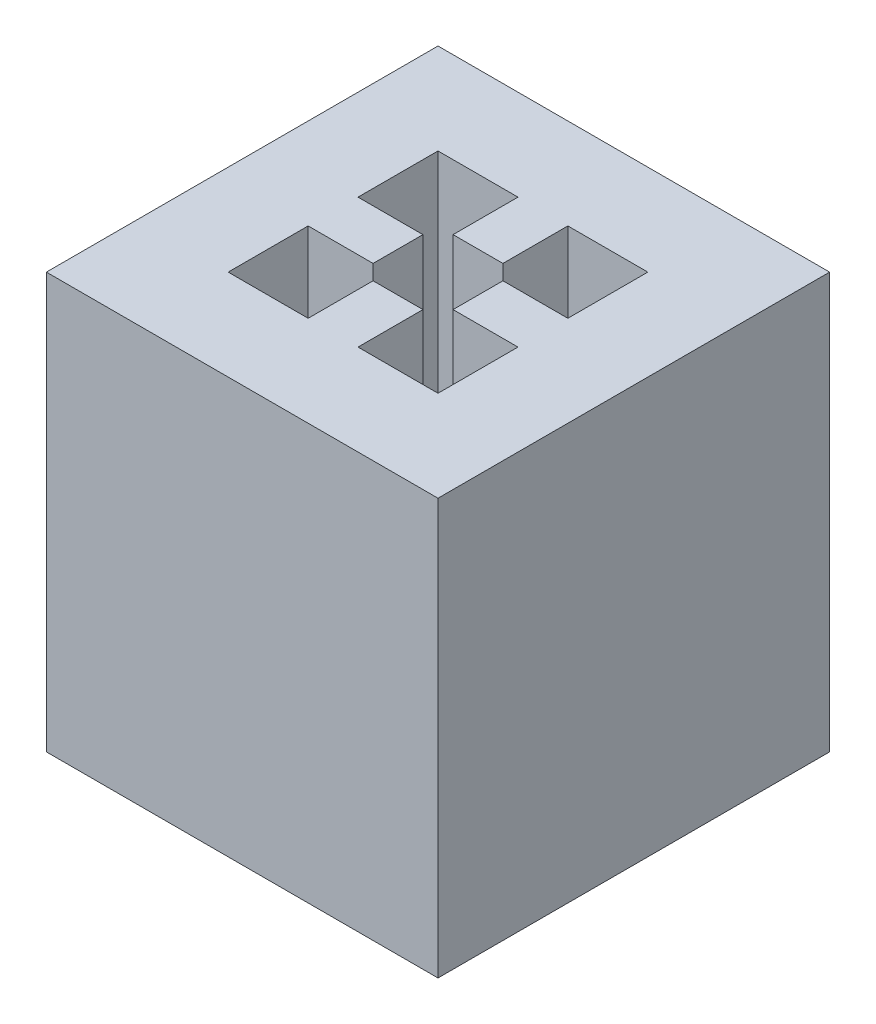
ISO-10303-21;
HEADER;
FILE_DESCRIPTION(('STEP AP214'),'2;1');
FILE_NAME('part.step','',(''),(''),'','','');
FILE_SCHEMA(('AUTOMOTIVE_DESIGN { 1 0 10303 214 1 1 1 1 }'));
ENDSEC;
DATA;
#1=APPLICATION_CONTEXT('core data for automotive mechanical design processes');
#2=APPLICATION_PROTOCOL_DEFINITION('international standard','automotive_design',2000,#1);
#3=PRODUCT_CONTEXT('',#1,'mechanical');
#4=PRODUCT('Part','Part','',(#3));
#5=PRODUCT_RELATED_PRODUCT_CATEGORY('part','',(#4));
#6=PRODUCT_DEFINITION_FORMATION('','',#4);
#7=PRODUCT_DEFINITION_CONTEXT('part definition',#1,'design');
#8=PRODUCT_DEFINITION('design','',#6,#7);
#9=PRODUCT_DEFINITION_SHAPE('','',#8);
#10=(LENGTH_UNIT() NAMED_UNIT(*) SI_UNIT(.MILLI.,.METRE.));
#11=(NAMED_UNIT(*) PLANE_ANGLE_UNIT() SI_UNIT($,.RADIAN.));
#12=(NAMED_UNIT(*) SI_UNIT($,.STERADIAN.) SOLID_ANGLE_UNIT());
#13=UNCERTAINTY_MEASURE_WITH_UNIT(LENGTH_MEASURE(1.E-05),#10,'distance_accuracy_value','');
#14=(GEOMETRIC_REPRESENTATION_CONTEXT(3) GLOBAL_UNCERTAINTY_ASSIGNED_CONTEXT((#13)) GLOBAL_UNIT_ASSIGNED_CONTEXT((#10,
#11,#12)) REPRESENTATION_CONTEXT('',''));
#15=CARTESIAN_POINT('',(0.,0.,0.));
#16=DIRECTION('',(0.,0.,1.));
#17=DIRECTION('',(1.,0.,0.));
#18=AXIS2_PLACEMENT_3D('',#15,#16,#17);
#19=CARTESIAN_POINT('',(0.,40.,0.));
#20=DIRECTION('',(0.,1.,0.));
#21=DIRECTION('',(0.,0.,1.));
#22=AXIS2_PLACEMENT_3D('',#19,#20,#21);
#23=PLANE('',#22);
#24=DIRECTION('',(0.,0.,-1.));
#25=VECTOR('',#24,1.);
#26=CARTESIAN_POINT('',(18.85,40.,-18.85));
#27=LINE('',#26,#25);
#28=CARTESIAN_POINT('',(18.85,40.,18.85));
#29=VERTEX_POINT('',#28);
#30=CARTESIAN_POINT('',(18.85,40.,-18.85));
#31=VERTEX_POINT('',#30);
#32=EDGE_CURVE('E343',#29,#31,#27,.T.);
#33=ORIENTED_EDGE('',*,*,#32,.T.);
#34=DIRECTION('',(-1.,0.,0.));
#35=VECTOR('',#34,1.);
#36=CARTESIAN_POINT('',(-18.85,40.,-18.85));
#37=LINE('',#36,#35);
#38=CARTESIAN_POINT('',(-18.85,40.,-18.85));
#39=VERTEX_POINT('',#38);
#40=EDGE_CURVE('E346',#31,#39,#37,.T.);
#41=ORIENTED_EDGE('',*,*,#40,.T.);
#42=DIRECTION('',(0.,0.,1.));
#43=VECTOR('',#42,1.);
#44=CARTESIAN_POINT('',(-18.85,40.,-18.85));
#45=LINE('',#44,#43);
#46=CARTESIAN_POINT('',(-18.85,40.,18.85));
#47=VERTEX_POINT('',#46);
#48=EDGE_CURVE('E349',#39,#47,#45,.T.);
#49=ORIENTED_EDGE('',*,*,#48,.T.);
#50=DIRECTION('',(1.,0.,0.));
#51=VECTOR('',#50,1.);
#52=CARTESIAN_POINT('',(-18.85,40.,18.85));
#53=LINE('',#52,#51);
#54=EDGE_CURVE('E351',#47,#29,#53,.T.);
#55=ORIENTED_EDGE('',*,*,#54,.T.);
#56=EDGE_LOOP('',(#33,#41,#49,#55));
#57=FACE_BOUND('',#56,.T.);
#58=DIRECTION('',(1.,0.,0.));
#59=VECTOR('',#58,1.);
#60=CARTESIAN_POINT('',(-10.0999999999999,40.,-2.40000000000002));
#61=LINE('',#60,#59);
#62=CARTESIAN_POINT('',(-10.0999999999999,40.,-2.40000000000002));
#63=VERTEX_POINT('',#62);
#64=CARTESIAN_POINT('',(-3.85000000000003,40.,-2.40000000000002));
#65=VERTEX_POINT('',#64);
#66=EDGE_CURVE('E202',#63,#65,#61,.T.);
#67=ORIENTED_EDGE('',*,*,#66,.F.);
#68=DIRECTION('',(0.,0.,1.));
#69=VECTOR('',#68,1.);
#70=CARTESIAN_POINT('',(-10.0999999999999,40.,-2.40000000000002));
#71=LINE('',#70,#69);
#72=CARTESIAN_POINT('',(-10.0999999999999,40.,-10.0999999999999));
#73=VERTEX_POINT('',#72);
#74=EDGE_CURVE('E194',#73,#63,#71,.T.);
#75=ORIENTED_EDGE('',*,*,#74,.F.);
#76=DIRECTION('',(-1.,0.,0.));
#77=VECTOR('',#76,1.);
#78=CARTESIAN_POINT('',(-10.0999999999999,40.,-10.0999999999999));
#79=LINE('',#78,#77);
#80=CARTESIAN_POINT('',(-2.40000000000002,40.,-10.0999999999999));
#81=VERTEX_POINT('',#80);
#82=EDGE_CURVE('E251',#81,#73,#79,.T.);
#83=ORIENTED_EDGE('',*,*,#82,.F.);
#84=DIRECTION('',(0.,0.,-1.));
#85=VECTOR('',#84,1.);
#86=CARTESIAN_POINT('',(-2.40000000000002,40.,-10.0999999999999));
#87=LINE('',#86,#85);
#88=CARTESIAN_POINT('',(-2.40000000000002,40.,-3.85000000000001));
#89=VERTEX_POINT('',#88);
#90=EDGE_CURVE('E249',#89,#81,#87,.T.);
#91=ORIENTED_EDGE('',*,*,#90,.F.);
#92=DIRECTION('',(-1.,0.,0.));
#93=VECTOR('',#92,1.);
#94=CARTESIAN_POINT('',(-2.40000000000002,40.,-3.85000000000001));
#95=LINE('',#94,#93);
#96=CARTESIAN_POINT('',(2.39999999999998,40.,-3.85000000000001));
#97=VERTEX_POINT('',#96);
#98=EDGE_CURVE('E247',#97,#89,#95,.T.);
#99=ORIENTED_EDGE('',*,*,#98,.F.);
#100=DIRECTION('',(0.,0.,1.));
#101=VECTOR('',#100,1.);
#102=CARTESIAN_POINT('',(2.39999999999998,40.,-3.85000000000001));
#103=LINE('',#102,#101);
#104=CARTESIAN_POINT('',(2.39999999999998,40.,-10.1));
#105=VERTEX_POINT('',#104);
#106=EDGE_CURVE('E245',#105,#97,#103,.T.);
#107=ORIENTED_EDGE('',*,*,#106,.F.);
#108=DIRECTION('',(-1.,0.,0.));
#109=VECTOR('',#108,1.);
#110=CARTESIAN_POINT('',(2.39999999999998,40.,-10.1));
#111=LINE('',#110,#109);
#112=CARTESIAN_POINT('',(10.0999999999999,40.,-10.1));
#113=VERTEX_POINT('',#112);
#114=EDGE_CURVE('E243',#113,#105,#111,.T.);
#115=ORIENTED_EDGE('',*,*,#114,.F.);
#116=DIRECTION('',(0.,0.,-1.));
#117=VECTOR('',#116,1.);
#118=CARTESIAN_POINT('',(10.0999999999999,40.,-10.1));
#119=LINE('',#118,#117);
#120=CARTESIAN_POINT('',(10.0999999999999,40.,-2.40000000000007));
#121=VERTEX_POINT('',#120);
#122=EDGE_CURVE('E241',#121,#113,#119,.T.);
#123=ORIENTED_EDGE('',*,*,#122,.F.);
#124=DIRECTION('',(1.,0.,0.));
#125=VECTOR('',#124,1.);
#126=CARTESIAN_POINT('',(10.0999999999999,40.,-2.40000000000007));
#127=LINE('',#126,#125);
#128=CARTESIAN_POINT('',(3.85000000000002,40.,-2.40000000000007));
#129=VERTEX_POINT('',#128);
#130=EDGE_CURVE('E239',#129,#121,#127,.T.);
#131=ORIENTED_EDGE('',*,*,#130,.F.);
#132=DIRECTION('',(0.,0.,-1.));
#133=VECTOR('',#132,1.);
#134=CARTESIAN_POINT('',(3.85000000000002,40.,2.39999999999994));
#135=LINE('',#134,#133);
#136=CARTESIAN_POINT('',(3.85000000000002,40.,2.39999999999994));
#137=VERTEX_POINT('',#136);
#138=EDGE_CURVE('E237',#137,#129,#135,.T.);
#139=ORIENTED_EDGE('',*,*,#138,.F.);
#140=DIRECTION('',(-1.,0.,0.));
#141=VECTOR('',#140,1.);
#142=CARTESIAN_POINT('',(10.1,40.,2.39999999999994));
#143=LINE('',#142,#141);
#144=CARTESIAN_POINT('',(10.1,40.,2.39999999999994));
#145=VERTEX_POINT('',#144);
#146=EDGE_CURVE('E235',#145,#137,#143,.T.);
#147=ORIENTED_EDGE('',*,*,#146,.F.);
#148=DIRECTION('',(0.,0.,-1.));
#149=VECTOR('',#148,1.);
#150=CARTESIAN_POINT('',(10.1,40.,10.0999999999999));
#151=LINE('',#150,#149);
#152=CARTESIAN_POINT('',(10.1,40.,10.0999999999999));
#153=VERTEX_POINT('',#152);
#154=EDGE_CURVE('E233',#153,#145,#151,.T.);
#155=ORIENTED_EDGE('',*,*,#154,.F.);
#156=DIRECTION('',(1.,0.,0.));
#157=VECTOR('',#156,1.);
#158=CARTESIAN_POINT('',(2.40000000000002,40.,10.0999999999999));
#159=LINE('',#158,#157);
#160=CARTESIAN_POINT('',(2.40000000000002,40.,10.0999999999999));
#161=VERTEX_POINT('',#160);
#162=EDGE_CURVE('E231',#161,#153,#159,.T.);
#163=ORIENTED_EDGE('',*,*,#162,.F.);
#164=DIRECTION('',(0.,0.,1.));
#165=VECTOR('',#164,1.);
#166=CARTESIAN_POINT('',(2.40000000000002,40.,3.84999999999998));
#167=LINE('',#166,#165);
#168=CARTESIAN_POINT('',(2.40000000000002,40.,3.84999999999998));
#169=VERTEX_POINT('',#168);
#170=EDGE_CURVE('E229',#169,#161,#167,.T.);
#171=ORIENTED_EDGE('',*,*,#170,.F.);
#172=DIRECTION('',(1.,0.,0.));
#173=VECTOR('',#172,1.);
#174=CARTESIAN_POINT('',(-2.4,40.,3.84999999999998));
#175=LINE('',#174,#173);
#176=CARTESIAN_POINT('',(-2.4,40.,3.84999999999998));
#177=VERTEX_POINT('',#176);
#178=EDGE_CURVE('E227',#177,#169,#175,.T.);
#179=ORIENTED_EDGE('',*,*,#178,.F.);
#180=DIRECTION('',(0.,0.,-1.));
#181=VECTOR('',#180,1.);
#182=CARTESIAN_POINT('',(-2.4,40.,10.0999999999999));
#183=LINE('',#182,#181);
#184=CARTESIAN_POINT('',(-2.4,40.,10.0999999999999));
#185=VERTEX_POINT('',#184);
#186=EDGE_CURVE('E225',#185,#177,#183,.T.);
#187=ORIENTED_EDGE('',*,*,#186,.F.);
#188=DIRECTION('',(1.,0.,0.));
#189=VECTOR('',#188,1.);
#190=CARTESIAN_POINT('',(-10.1,40.,10.0999999999999));
#191=LINE('',#190,#189);
#192=CARTESIAN_POINT('',(-10.1,40.,10.0999999999999));
#193=VERTEX_POINT('',#192);
#194=EDGE_CURVE('E223',#193,#185,#191,.T.);
#195=ORIENTED_EDGE('',*,*,#194,.F.);
#196=DIRECTION('',(0.,0.,1.));
#197=VECTOR('',#196,1.);
#198=CARTESIAN_POINT('',(-10.1,40.,2.39999999999998));
#199=LINE('',#198,#197);
#200=CARTESIAN_POINT('',(-10.1,40.,2.39999999999998));
#201=VERTEX_POINT('',#200);
#202=EDGE_CURVE('E221',#201,#193,#199,.T.);
#203=ORIENTED_EDGE('',*,*,#202,.F.);
#204=DIRECTION('',(-1.,0.,0.));
#205=VECTOR('',#204,1.);
#206=CARTESIAN_POINT('',(-3.85000000000003,40.,2.39999999999998));
#207=LINE('',#206,#205);
#208=CARTESIAN_POINT('',(-3.85000000000003,40.,2.39999999999998));
#209=VERTEX_POINT('',#208);
#210=EDGE_CURVE('E217',#209,#201,#207,.T.);
#211=ORIENTED_EDGE('',*,*,#210,.F.);
#212=DIRECTION('',(0.,0.,1.));
#213=VECTOR('',#212,1.);
#214=CARTESIAN_POINT('',(-3.85000000000003,40.,-2.40000000000002));
#215=LINE('',#214,#213);
#216=EDGE_CURVE('E215',#65,#209,#215,.T.);
#217=ORIENTED_EDGE('',*,*,#216,.F.);
#218=EDGE_LOOP('',(#67,#75,#83,#91,#99,#107,#115,#123,#131,#139,#147,#155,#163,#171,#179,#187,
#195,#203,#211,#217));
#219=FACE_BOUND('',#218,.T.);
#220=ADVANCED_FACE('F33',(#57,#219),#23,.T.);
#221=CARTESIAN_POINT('',(0.,0.,0.));
#222=DIRECTION('',(0.,1.,0.));
#223=DIRECTION('',(0.,0.,1.));
#224=AXIS2_PLACEMENT_3D('',#221,#222,#223);
#225=PLANE('',#224);
#226=DIRECTION('',(0.,0.,-1.));
#227=VECTOR('',#226,1.);
#228=CARTESIAN_POINT('',(18.85,0.,-18.85));
#229=LINE('',#228,#227);
#230=CARTESIAN_POINT('',(18.85,0.,18.85));
#231=VERTEX_POINT('',#230);
#232=CARTESIAN_POINT('',(18.85,0.,-18.85));
#233=VERTEX_POINT('',#232);
#234=EDGE_CURVE('E210',#231,#233,#229,.T.);
#235=ORIENTED_EDGE('',*,*,#234,.F.);
#236=DIRECTION('',(1.,0.,0.));
#237=VECTOR('',#236,1.);
#238=CARTESIAN_POINT('',(-18.85,0.,18.85));
#239=LINE('',#238,#237);
#240=CARTESIAN_POINT('',(-18.85,0.,18.85));
#241=VERTEX_POINT('',#240);
#242=EDGE_CURVE('E347',#241,#231,#239,.T.);
#243=ORIENTED_EDGE('',*,*,#242,.F.);
#244=DIRECTION('',(0.,0.,1.));
#245=VECTOR('',#244,1.);
#246=CARTESIAN_POINT('',(-18.85,0.,-18.85));
#247=LINE('',#246,#245);
#248=CARTESIAN_POINT('',(-18.85,0.,-18.85));
#249=VERTEX_POINT('',#248);
#250=EDGE_CURVE('E358',#249,#241,#247,.T.);
#251=ORIENTED_EDGE('',*,*,#250,.F.);
#252=DIRECTION('',(-1.,0.,0.));
#253=VECTOR('',#252,1.);
#254=CARTESIAN_POINT('',(-18.85,0.,-18.85));
#255=LINE('',#254,#253);
#256=EDGE_CURVE('E356',#233,#249,#255,.T.);
#257=ORIENTED_EDGE('',*,*,#256,.F.);
#258=EDGE_LOOP('',(#235,#243,#251,#257));
#259=FACE_BOUND('',#258,.T.);
#260=DIRECTION('',(0.,0.,1.));
#261=VECTOR('',#260,1.);
#262=CARTESIAN_POINT('',(-10.0999999999999,0.,-2.40000000000002));
#263=LINE('',#262,#261);
#264=CARTESIAN_POINT('',(-10.0999999999999,0.,-10.0999999999999));
#265=VERTEX_POINT('',#264);
#266=CARTESIAN_POINT('',(-10.0999999999999,0.,-2.40000000000002));
#267=VERTEX_POINT('',#266);
#268=EDGE_CURVE('E56',#265,#267,#263,.T.);
#269=ORIENTED_EDGE('',*,*,#268,.T.);
#270=DIRECTION('',(1.,0.,0.));
#271=VECTOR('',#270,1.);
#272=CARTESIAN_POINT('',(-10.0999999999999,0.,-2.40000000000002));
#273=LINE('',#272,#271);
#274=CARTESIAN_POINT('',(-3.85000000000003,0.,-2.40000000000002));
#275=VERTEX_POINT('',#274);
#276=EDGE_CURVE('E209',#267,#275,#273,.T.);
#277=ORIENTED_EDGE('',*,*,#276,.T.);
#278=DIRECTION('',(0.,0.,1.));
#279=VECTOR('',#278,1.);
#280=CARTESIAN_POINT('',(-3.85000000000003,0.,-2.40000000000002));
#281=LINE('',#280,#279);
#282=CARTESIAN_POINT('',(-3.85000000000003,0.,2.39999999999998));
#283=VERTEX_POINT('',#282);
#284=EDGE_CURVE('E255',#275,#283,#281,.T.);
#285=ORIENTED_EDGE('',*,*,#284,.T.);
#286=DIRECTION('',(-1.,0.,0.));
#287=VECTOR('',#286,1.);
#288=CARTESIAN_POINT('',(-3.85000000000003,0.,2.39999999999998));
#289=LINE('',#288,#287);
#290=CARTESIAN_POINT('',(-10.1,0.,2.39999999999998));
#291=VERTEX_POINT('',#290);
#292=EDGE_CURVE('E258',#283,#291,#289,.T.);
#293=ORIENTED_EDGE('',*,*,#292,.T.);
#294=DIRECTION('',(0.,0.,1.));
#295=VECTOR('',#294,1.);
#296=CARTESIAN_POINT('',(-10.1,0.,2.39999999999998));
#297=LINE('',#296,#295);
#298=CARTESIAN_POINT('',(-10.1,0.,10.0999999999999));
#299=VERTEX_POINT('',#298);
#300=EDGE_CURVE('E261',#291,#299,#297,.T.);
#301=ORIENTED_EDGE('',*,*,#300,.T.);
#302=DIRECTION('',(1.,0.,0.));
#303=VECTOR('',#302,1.);
#304=CARTESIAN_POINT('',(-10.1,0.,10.0999999999999));
#305=LINE('',#304,#303);
#306=CARTESIAN_POINT('',(-2.4,0.,10.0999999999999));
#307=VERTEX_POINT('',#306);
#308=EDGE_CURVE('E264',#299,#307,#305,.T.);
#309=ORIENTED_EDGE('',*,*,#308,.T.);
#310=DIRECTION('',(0.,0.,-1.));
#311=VECTOR('',#310,1.);
#312=CARTESIAN_POINT('',(-2.4,0.,10.0999999999999));
#313=LINE('',#312,#311);
#314=CARTESIAN_POINT('',(-2.4,0.,3.84999999999998));
#315=VERTEX_POINT('',#314);
#316=EDGE_CURVE('E267',#307,#315,#313,.T.);
#317=ORIENTED_EDGE('',*,*,#316,.T.);
#318=DIRECTION('',(1.,0.,0.));
#319=VECTOR('',#318,1.);
#320=CARTESIAN_POINT('',(-2.4,0.,3.84999999999998));
#321=LINE('',#320,#319);
#322=CARTESIAN_POINT('',(2.40000000000002,0.,3.84999999999998));
#323=VERTEX_POINT('',#322);
#324=EDGE_CURVE('E270',#315,#323,#321,.T.);
#325=ORIENTED_EDGE('',*,*,#324,.T.);
#326=DIRECTION('',(0.,0.,1.));
#327=VECTOR('',#326,1.);
#328=CARTESIAN_POINT('',(2.40000000000002,0.,3.84999999999998));
#329=LINE('',#328,#327);
#330=CARTESIAN_POINT('',(2.40000000000002,0.,10.0999999999999));
#331=VERTEX_POINT('',#330);
#332=EDGE_CURVE('E273',#323,#331,#329,.T.);
#333=ORIENTED_EDGE('',*,*,#332,.T.);
#334=DIRECTION('',(1.,0.,0.));
#335=VECTOR('',#334,1.);
#336=CARTESIAN_POINT('',(2.40000000000002,0.,10.0999999999999));
#337=LINE('',#336,#335);
#338=CARTESIAN_POINT('',(10.1,0.,10.0999999999999));
#339=VERTEX_POINT('',#338);
#340=EDGE_CURVE('E276',#331,#339,#337,.T.);
#341=ORIENTED_EDGE('',*,*,#340,.T.);
#342=DIRECTION('',(0.,0.,-1.));
#343=VECTOR('',#342,1.);
#344=CARTESIAN_POINT('',(10.1,0.,10.0999999999999));
#345=LINE('',#344,#343);
#346=CARTESIAN_POINT('',(10.1,0.,2.39999999999994));
#347=VERTEX_POINT('',#346);
#348=EDGE_CURVE('E279',#339,#347,#345,.T.);
#349=ORIENTED_EDGE('',*,*,#348,.T.);
#350=DIRECTION('',(-1.,0.,0.));
#351=VECTOR('',#350,1.);
#352=CARTESIAN_POINT('',(10.1,0.,2.39999999999994));
#353=LINE('',#352,#351);
#354=CARTESIAN_POINT('',(3.85000000000002,0.,2.39999999999994));
#355=VERTEX_POINT('',#354);
#356=EDGE_CURVE('E282',#347,#355,#353,.T.);
#357=ORIENTED_EDGE('',*,*,#356,.T.);
#358=DIRECTION('',(0.,0.,-1.));
#359=VECTOR('',#358,1.);
#360=CARTESIAN_POINT('',(3.85000000000002,0.,2.39999999999994));
#361=LINE('',#360,#359);
#362=CARTESIAN_POINT('',(3.85000000000002,0.,-2.40000000000007));
#363=VERTEX_POINT('',#362);
#364=EDGE_CURVE('E285',#355,#363,#361,.T.);
#365=ORIENTED_EDGE('',*,*,#364,.T.);
#366=DIRECTION('',(1.,0.,0.));
#367=VECTOR('',#366,1.);
#368=CARTESIAN_POINT('',(10.0999999999999,0.,-2.40000000000007));
#369=LINE('',#368,#367);
#370=CARTESIAN_POINT('',(10.0999999999999,0.,-2.40000000000007));
#371=VERTEX_POINT('',#370);
#372=EDGE_CURVE('E288',#363,#371,#369,.T.);
#373=ORIENTED_EDGE('',*,*,#372,.T.);
#374=DIRECTION('',(0.,0.,-1.));
#375=VECTOR('',#374,1.);
#376=CARTESIAN_POINT('',(10.0999999999999,0.,-10.1));
#377=LINE('',#376,#375);
#378=CARTESIAN_POINT('',(10.0999999999999,0.,-10.1));
#379=VERTEX_POINT('',#378);
#380=EDGE_CURVE('E291',#371,#379,#377,.T.);
#381=ORIENTED_EDGE('',*,*,#380,.T.);
#382=DIRECTION('',(-1.,0.,0.));
#383=VECTOR('',#382,1.);
#384=CARTESIAN_POINT('',(2.39999999999998,0.,-10.1));
#385=LINE('',#384,#383);
#386=CARTESIAN_POINT('',(2.39999999999998,0.,-10.1));
#387=VERTEX_POINT('',#386);
#388=EDGE_CURVE('E294',#379,#387,#385,.T.);
#389=ORIENTED_EDGE('',*,*,#388,.T.);
#390=DIRECTION('',(0.,0.,1.));
#391=VECTOR('',#390,1.);
#392=CARTESIAN_POINT('',(2.39999999999998,0.,-3.85000000000001));
#393=LINE('',#392,#391);
#394=CARTESIAN_POINT('',(2.39999999999998,0.,-3.85000000000001));
#395=VERTEX_POINT('',#394);
#396=EDGE_CURVE('E297',#387,#395,#393,.T.);
#397=ORIENTED_EDGE('',*,*,#396,.T.);
#398=DIRECTION('',(-1.,0.,0.));
#399=VECTOR('',#398,1.);
#400=CARTESIAN_POINT('',(-2.40000000000002,0.,-3.85000000000001));
#401=LINE('',#400,#399);
#402=CARTESIAN_POINT('',(-2.40000000000002,0.,-3.85000000000001));
#403=VERTEX_POINT('',#402);
#404=EDGE_CURVE('E300',#395,#403,#401,.T.);
#405=ORIENTED_EDGE('',*,*,#404,.T.);
#406=DIRECTION('',(0.,0.,-1.));
#407=VECTOR('',#406,1.);
#408=CARTESIAN_POINT('',(-2.40000000000002,0.,-10.0999999999999));
#409=LINE('',#408,#407);
#410=CARTESIAN_POINT('',(-2.40000000000002,0.,-10.0999999999999));
#411=VERTEX_POINT('',#410);
#412=EDGE_CURVE('E303',#403,#411,#409,.T.);
#413=ORIENTED_EDGE('',*,*,#412,.T.);
#414=DIRECTION('',(-1.,0.,0.));
#415=VECTOR('',#414,1.);
#416=CARTESIAN_POINT('',(-10.0999999999999,0.,-10.0999999999999));
#417=LINE('',#416,#415);
#418=EDGE_CURVE('E203',#411,#265,#417,.T.);
#419=ORIENTED_EDGE('',*,*,#418,.T.);
#420=EDGE_LOOP('',(#269,#277,#285,#293,#301,#309,#317,#325,#333,#341,#349,#357,#365,#373,#381,
#389,#397,#405,#413,#419));
#421=FACE_BOUND('',#420,.T.);
#422=ADVANCED_FACE('F376',(#259,#421),#225,.F.);
#423=CARTESIAN_POINT('',(18.85,40.,-18.85));
#424=DIRECTION('',(-1.,0.,0.));
#425=DIRECTION('',(0.,0.,1.));
#426=AXIS2_PLACEMENT_3D('',#423,#424,#425);
#427=PLANE('',#426);
#428=ORIENTED_EDGE('',*,*,#234,.T.);
#429=DIRECTION('',(0.,-1.,0.));
#430=VECTOR('',#429,1.);
#431=CARTESIAN_POINT('',(18.85,40.,-18.85));
#432=LINE('',#431,#430);
#433=EDGE_CURVE('E11',#31,#233,#432,.T.);
#434=ORIENTED_EDGE('',*,*,#433,.F.);
#435=ORIENTED_EDGE('',*,*,#32,.F.);
#436=DIRECTION('',(0.,-1.,0.));
#437=VECTOR('',#436,1.);
#438=CARTESIAN_POINT('',(18.85,40.,18.85));
#439=LINE('',#438,#437);
#440=EDGE_CURVE('E353',#29,#231,#439,.T.);
#441=ORIENTED_EDGE('',*,*,#440,.T.);
#442=EDGE_LOOP('',(#428,#434,#435,#441));
#443=FACE_BOUND('',#442,.T.);
#444=ADVANCED_FACE('F35',(#443),#427,.F.);
#445=CARTESIAN_POINT('',(-18.85,40.,-18.85));
#446=DIRECTION('',(0.,0.,1.));
#447=DIRECTION('',(1.,0.,0.));
#448=AXIS2_PLACEMENT_3D('',#445,#446,#447);
#449=PLANE('',#448);
#450=ORIENTED_EDGE('',*,*,#256,.T.);
#451=DIRECTION('',(0.,-1.,0.));
#452=VECTOR('',#451,1.);
#453=CARTESIAN_POINT('',(-18.85,40.,-18.85));
#454=LINE('',#453,#452);
#455=EDGE_CURVE('E41',#39,#249,#454,.T.);
#456=ORIENTED_EDGE('',*,*,#455,.F.);
#457=ORIENTED_EDGE('',*,*,#40,.F.);
#458=ORIENTED_EDGE('',*,*,#433,.T.);
#459=EDGE_LOOP('',(#450,#456,#457,#458));
#460=FACE_BOUND('',#459,.T.);
#461=ADVANCED_FACE('F386',(#460),#449,.F.);
#462=CARTESIAN_POINT('',(-18.85,40.,-18.85));
#463=DIRECTION('',(1.,0.,0.));
#464=DIRECTION('',(0.,0.,-1.));
#465=AXIS2_PLACEMENT_3D('',#462,#463,#464);
#466=PLANE('',#465);
#467=ORIENTED_EDGE('',*,*,#250,.T.);
#468=DIRECTION('',(0.,-1.,0.));
#469=VECTOR('',#468,1.);
#470=CARTESIAN_POINT('',(-18.85,40.,18.85));
#471=LINE('',#470,#469);
#472=EDGE_CURVE('E363',#47,#241,#471,.T.);
#473=ORIENTED_EDGE('',*,*,#472,.F.);
#474=ORIENTED_EDGE('',*,*,#48,.F.);
#475=ORIENTED_EDGE('',*,*,#455,.T.);
#476=EDGE_LOOP('',(#467,#473,#474,#475));
#477=FACE_BOUND('',#476,.T.);
#478=ADVANCED_FACE('F370',(#477),#466,.F.);
#479=CARTESIAN_POINT('',(-18.85,40.,18.85));
#480=DIRECTION('',(0.,0.,-1.));
#481=DIRECTION('',(-1.,0.,0.));
#482=AXIS2_PLACEMENT_3D('',#479,#480,#481);
#483=PLANE('',#482);
#484=ORIENTED_EDGE('',*,*,#242,.T.);
#485=ORIENTED_EDGE('',*,*,#440,.F.);
#486=ORIENTED_EDGE('',*,*,#54,.F.);
#487=ORIENTED_EDGE('',*,*,#472,.T.);
#488=EDGE_LOOP('',(#484,#485,#486,#487));
#489=FACE_BOUND('',#488,.T.);
#490=ADVANCED_FACE('F380',(#489),#483,.F.);
#491=CARTESIAN_POINT('',(-10.0999999999999,40.,-2.40000000000002));
#492=DIRECTION('',(1.,0.,0.));
#493=DIRECTION('',(0.,0.,-1.));
#494=AXIS2_PLACEMENT_3D('',#491,#492,#493);
#495=PLANE('',#494);
#496=ORIENTED_EDGE('',*,*,#268,.F.);
#497=DIRECTION('',(0.,-1.,0.));
#498=VECTOR('',#497,1.);
#499=CARTESIAN_POINT('',(-10.0999999999999,40.,-10.0999999999999));
#500=LINE('',#499,#498);
#501=EDGE_CURVE('E198',#73,#265,#500,.T.);
#502=ORIENTED_EDGE('',*,*,#501,.F.);
#503=ORIENTED_EDGE('',*,*,#74,.T.);
#504=DIRECTION('',(0.,-1.,0.));
#505=VECTOR('',#504,1.);
#506=CARTESIAN_POINT('',(-10.0999999999999,40.,-2.40000000000002));
#507=LINE('',#506,#505);
#508=EDGE_CURVE('E197',#63,#267,#507,.T.);
#509=ORIENTED_EDGE('',*,*,#508,.T.);
#510=EDGE_LOOP('',(#496,#502,#503,#509));
#511=FACE_BOUND('',#510,.T.);
#512=ADVANCED_FACE('F196',(#511),#495,.T.);
#513=CARTESIAN_POINT('',(-10.0999999999999,40.,-2.40000000000002));
#514=DIRECTION('',(0.,0.,-1.));
#515=DIRECTION('',(-1.,0.,0.));
#516=AXIS2_PLACEMENT_3D('',#513,#514,#515);
#517=PLANE('',#516);
#518=ORIENTED_EDGE('',*,*,#276,.F.);
#519=ORIENTED_EDGE('',*,*,#508,.F.);
#520=ORIENTED_EDGE('',*,*,#66,.T.);
#521=DIRECTION('',(0.,-1.,0.));
#522=VECTOR('',#521,1.);
#523=CARTESIAN_POINT('',(-3.85000000000003,40.,-2.40000000000002));
#524=LINE('',#523,#522);
#525=EDGE_CURVE('E211',#65,#275,#524,.T.);
#526=ORIENTED_EDGE('',*,*,#525,.T.);
#527=EDGE_LOOP('',(#518,#519,#520,#526));
#528=FACE_BOUND('',#527,.T.);
#529=ADVANCED_FACE('F206',(#528),#517,.T.);
#530=CARTESIAN_POINT('',(-3.85000000000003,40.,-2.40000000000002));
#531=DIRECTION('',(1.,0.,0.));
#532=DIRECTION('',(0.,0.,-1.));
#533=AXIS2_PLACEMENT_3D('',#530,#531,#532);
#534=PLANE('',#533);
#535=ORIENTED_EDGE('',*,*,#284,.F.);
#536=ORIENTED_EDGE('',*,*,#525,.F.);
#537=ORIENTED_EDGE('',*,*,#216,.T.);
#538=DIRECTION('',(0.,-1.,0.));
#539=VECTOR('',#538,1.);
#540=CARTESIAN_POINT('',(-3.85000000000003,40.,2.39999999999998));
#541=LINE('',#540,#539);
#542=EDGE_CURVE('E340',#209,#283,#541,.T.);
#543=ORIENTED_EDGE('',*,*,#542,.T.);
#544=EDGE_LOOP('',(#535,#536,#537,#543));
#545=FACE_BOUND('',#544,.T.);
#546=ADVANCED_FACE('F409',(#545),#534,.T.);
#547=CARTESIAN_POINT('',(-3.85000000000003,40.,2.39999999999998));
#548=DIRECTION('',(0.,0.,1.));
#549=DIRECTION('',(1.,0.,0.));
#550=AXIS2_PLACEMENT_3D('',#547,#548,#549);
#551=PLANE('',#550);
#552=ORIENTED_EDGE('',*,*,#292,.F.);
#553=ORIENTED_EDGE('',*,*,#542,.F.);
#554=ORIENTED_EDGE('',*,*,#210,.T.);
#555=DIRECTION('',(0.,-1.,0.));
#556=VECTOR('',#555,1.);
#557=CARTESIAN_POINT('',(-10.1,40.,2.39999999999998));
#558=LINE('',#557,#556);
#559=EDGE_CURVE('E338',#201,#291,#558,.T.);
#560=ORIENTED_EDGE('',*,*,#559,.T.);
#561=EDGE_LOOP('',(#552,#553,#554,#560));
#562=FACE_BOUND('',#561,.T.);
#563=ADVANCED_FACE('F413',(#562),#551,.T.);
#564=CARTESIAN_POINT('',(-10.1,40.,2.39999999999998));
#565=DIRECTION('',(1.,0.,0.));
#566=DIRECTION('',(0.,0.,-1.));
#567=AXIS2_PLACEMENT_3D('',#564,#565,#566);
#568=PLANE('',#567);
#569=ORIENTED_EDGE('',*,*,#300,.F.);
#570=ORIENTED_EDGE('',*,*,#559,.F.);
#571=ORIENTED_EDGE('',*,*,#202,.T.);
#572=DIRECTION('',(0.,-1.,0.));
#573=VECTOR('',#572,1.);
#574=CARTESIAN_POINT('',(-10.1,40.,10.0999999999999));
#575=LINE('',#574,#573);
#576=EDGE_CURVE('E336',#193,#299,#575,.T.);
#577=ORIENTED_EDGE('',*,*,#576,.T.);
#578=EDGE_LOOP('',(#569,#570,#571,#577));
#579=FACE_BOUND('',#578,.T.);
#580=ADVANCED_FACE('F419',(#579),#568,.T.);
#581=CARTESIAN_POINT('',(-10.1,40.,10.0999999999999));
#582=DIRECTION('',(0.,0.,-1.));
#583=DIRECTION('',(-1.,0.,0.));
#584=AXIS2_PLACEMENT_3D('',#581,#582,#583);
#585=PLANE('',#584);
#586=ORIENTED_EDGE('',*,*,#308,.F.);
#587=ORIENTED_EDGE('',*,*,#576,.F.);
#588=ORIENTED_EDGE('',*,*,#194,.T.);
#589=DIRECTION('',(0.,-1.,0.));
#590=VECTOR('',#589,1.);
#591=CARTESIAN_POINT('',(-2.4,40.,10.0999999999999));
#592=LINE('',#591,#590);
#593=EDGE_CURVE('E334',#185,#307,#592,.T.);
#594=ORIENTED_EDGE('',*,*,#593,.T.);
#595=EDGE_LOOP('',(#586,#587,#588,#594));
#596=FACE_BOUND('',#595,.T.);
#597=ADVANCED_FACE('F423',(#596),#585,.T.);
#598=CARTESIAN_POINT('',(-2.4,40.,10.0999999999999));
#599=DIRECTION('',(-1.,0.,0.));
#600=DIRECTION('',(0.,0.,1.));
#601=AXIS2_PLACEMENT_3D('',#598,#599,#600);
#602=PLANE('',#601);
#603=ORIENTED_EDGE('',*,*,#316,.F.);
#604=ORIENTED_EDGE('',*,*,#593,.F.);
#605=ORIENTED_EDGE('',*,*,#186,.T.);
#606=DIRECTION('',(0.,-1.,0.));
#607=VECTOR('',#606,1.);
#608=CARTESIAN_POINT('',(-2.4,40.,3.84999999999998));
#609=LINE('',#608,#607);
#610=EDGE_CURVE('E332',#177,#315,#609,.T.);
#611=ORIENTED_EDGE('',*,*,#610,.T.);
#612=EDGE_LOOP('',(#603,#604,#605,#611));
#613=FACE_BOUND('',#612,.T.);
#614=ADVANCED_FACE('F427',(#613),#602,.T.);
#615=CARTESIAN_POINT('',(-2.4,40.,3.84999999999998));
#616=DIRECTION('',(0.,0.,-1.));
#617=DIRECTION('',(-1.,0.,0.));
#618=AXIS2_PLACEMENT_3D('',#615,#616,#617);
#619=PLANE('',#618);
#620=ORIENTED_EDGE('',*,*,#324,.F.);
#621=ORIENTED_EDGE('',*,*,#610,.F.);
#622=ORIENTED_EDGE('',*,*,#178,.T.);
#623=DIRECTION('',(0.,-1.,0.));
#624=VECTOR('',#623,1.);
#625=CARTESIAN_POINT('',(2.40000000000002,40.,3.84999999999998));
#626=LINE('',#625,#624);
#627=EDGE_CURVE('E330',#169,#323,#626,.T.);
#628=ORIENTED_EDGE('',*,*,#627,.T.);
#629=EDGE_LOOP('',(#620,#621,#622,#628));
#630=FACE_BOUND('',#629,.T.);
#631=ADVANCED_FACE('F431',(#630),#619,.T.);
#632=CARTESIAN_POINT('',(2.40000000000002,40.,3.84999999999998));
#633=DIRECTION('',(1.,0.,0.));
#634=DIRECTION('',(0.,0.,-1.));
#635=AXIS2_PLACEMENT_3D('',#632,#633,#634);
#636=PLANE('',#635);
#637=ORIENTED_EDGE('',*,*,#332,.F.);
#638=ORIENTED_EDGE('',*,*,#627,.F.);
#639=ORIENTED_EDGE('',*,*,#170,.T.);
#640=DIRECTION('',(0.,-1.,0.));
#641=VECTOR('',#640,1.);
#642=CARTESIAN_POINT('',(2.40000000000002,40.,10.0999999999999));
#643=LINE('',#642,#641);
#644=EDGE_CURVE('E328',#161,#331,#643,.T.);
#645=ORIENTED_EDGE('',*,*,#644,.T.);
#646=EDGE_LOOP('',(#637,#638,#639,#645));
#647=FACE_BOUND('',#646,.T.);
#648=ADVANCED_FACE('F435',(#647),#636,.T.);
#649=CARTESIAN_POINT('',(2.40000000000002,40.,10.0999999999999));
#650=DIRECTION('',(0.,0.,-1.));
#651=DIRECTION('',(-1.,0.,0.));
#652=AXIS2_PLACEMENT_3D('',#649,#650,#651);
#653=PLANE('',#652);
#654=ORIENTED_EDGE('',*,*,#340,.F.);
#655=ORIENTED_EDGE('',*,*,#644,.F.);
#656=ORIENTED_EDGE('',*,*,#162,.T.);
#657=DIRECTION('',(0.,-1.,0.));
#658=VECTOR('',#657,1.);
#659=CARTESIAN_POINT('',(10.1,40.,10.0999999999999));
#660=LINE('',#659,#658);
#661=EDGE_CURVE('E326',#153,#339,#660,.T.);
#662=ORIENTED_EDGE('',*,*,#661,.T.);
#663=EDGE_LOOP('',(#654,#655,#656,#662));
#664=FACE_BOUND('',#663,.T.);
#665=ADVANCED_FACE('F439',(#664),#653,.T.);
#666=CARTESIAN_POINT('',(10.1,40.,10.0999999999999));
#667=DIRECTION('',(-1.,0.,0.));
#668=DIRECTION('',(0.,0.,1.));
#669=AXIS2_PLACEMENT_3D('',#666,#667,#668);
#670=PLANE('',#669);
#671=ORIENTED_EDGE('',*,*,#348,.F.);
#672=ORIENTED_EDGE('',*,*,#661,.F.);
#673=ORIENTED_EDGE('',*,*,#154,.T.);
#674=DIRECTION('',(0.,-1.,0.));
#675=VECTOR('',#674,1.);
#676=CARTESIAN_POINT('',(10.1,40.,2.39999999999994));
#677=LINE('',#676,#675);
#678=EDGE_CURVE('E324',#145,#347,#677,.T.);
#679=ORIENTED_EDGE('',*,*,#678,.T.);
#680=EDGE_LOOP('',(#671,#672,#673,#679));
#681=FACE_BOUND('',#680,.T.);
#682=ADVANCED_FACE('F443',(#681),#670,.T.);
#683=CARTESIAN_POINT('',(10.1,40.,2.39999999999994));
#684=DIRECTION('',(0.,0.,1.));
#685=DIRECTION('',(1.,0.,0.));
#686=AXIS2_PLACEMENT_3D('',#683,#684,#685);
#687=PLANE('',#686);
#688=ORIENTED_EDGE('',*,*,#356,.F.);
#689=ORIENTED_EDGE('',*,*,#678,.F.);
#690=ORIENTED_EDGE('',*,*,#146,.T.);
#691=DIRECTION('',(0.,-1.,0.));
#692=VECTOR('',#691,1.);
#693=CARTESIAN_POINT('',(3.85000000000002,40.,2.39999999999994));
#694=LINE('',#693,#692);
#695=EDGE_CURVE('E322',#137,#355,#694,.T.);
#696=ORIENTED_EDGE('',*,*,#695,.T.);
#697=EDGE_LOOP('',(#688,#689,#690,#696));
#698=FACE_BOUND('',#697,.T.);
#699=ADVANCED_FACE('F447',(#698),#687,.T.);
#700=CARTESIAN_POINT('',(3.85000000000002,40.,2.39999999999994));
#701=DIRECTION('',(-1.,0.,0.));
#702=DIRECTION('',(0.,0.,1.));
#703=AXIS2_PLACEMENT_3D('',#700,#701,#702);
#704=PLANE('',#703);
#705=ORIENTED_EDGE('',*,*,#364,.F.);
#706=ORIENTED_EDGE('',*,*,#695,.F.);
#707=ORIENTED_EDGE('',*,*,#138,.T.);
#708=DIRECTION('',(0.,-1.,0.));
#709=VECTOR('',#708,1.);
#710=CARTESIAN_POINT('',(3.85000000000002,40.,-2.40000000000007));
#711=LINE('',#710,#709);
#712=EDGE_CURVE('E320',#129,#363,#711,.T.);
#713=ORIENTED_EDGE('',*,*,#712,.T.);
#714=EDGE_LOOP('',(#705,#706,#707,#713));
#715=FACE_BOUND('',#714,.T.);
#716=ADVANCED_FACE('F451',(#715),#704,.T.);
#717=CARTESIAN_POINT('',(10.0999999999999,40.,-2.40000000000007));
#718=DIRECTION('',(0.,0.,-1.));
#719=DIRECTION('',(-1.,0.,0.));
#720=AXIS2_PLACEMENT_3D('',#717,#718,#719);
#721=PLANE('',#720);
#722=ORIENTED_EDGE('',*,*,#372,.F.);
#723=ORIENTED_EDGE('',*,*,#712,.F.);
#724=ORIENTED_EDGE('',*,*,#130,.T.);
#725=DIRECTION('',(0.,-1.,0.));
#726=VECTOR('',#725,1.);
#727=CARTESIAN_POINT('',(10.0999999999999,40.,-2.40000000000007));
#728=LINE('',#727,#726);
#729=EDGE_CURVE('E318',#121,#371,#728,.T.);
#730=ORIENTED_EDGE('',*,*,#729,.T.);
#731=EDGE_LOOP('',(#722,#723,#724,#730));
#732=FACE_BOUND('',#731,.T.);
#733=ADVANCED_FACE('F455',(#732),#721,.T.);
#734=CARTESIAN_POINT('',(10.0999999999999,40.,-10.1));
#735=DIRECTION('',(-1.,0.,0.));
#736=DIRECTION('',(0.,0.,1.));
#737=AXIS2_PLACEMENT_3D('',#734,#735,#736);
#738=PLANE('',#737);
#739=ORIENTED_EDGE('',*,*,#380,.F.);
#740=ORIENTED_EDGE('',*,*,#729,.F.);
#741=ORIENTED_EDGE('',*,*,#122,.T.);
#742=DIRECTION('',(0.,-1.,0.));
#743=VECTOR('',#742,1.);
#744=CARTESIAN_POINT('',(10.0999999999999,40.,-10.1));
#745=LINE('',#744,#743);
#746=EDGE_CURVE('E316',#113,#379,#745,.T.);
#747=ORIENTED_EDGE('',*,*,#746,.T.);
#748=EDGE_LOOP('',(#739,#740,#741,#747));
#749=FACE_BOUND('',#748,.T.);
#750=ADVANCED_FACE('F459',(#749),#738,.T.);
#751=CARTESIAN_POINT('',(2.39999999999998,40.,-10.1));
#752=DIRECTION('',(0.,0.,1.));
#753=DIRECTION('',(1.,0.,0.));
#754=AXIS2_PLACEMENT_3D('',#751,#752,#753);
#755=PLANE('',#754);
#756=ORIENTED_EDGE('',*,*,#388,.F.);
#757=ORIENTED_EDGE('',*,*,#746,.F.);
#758=ORIENTED_EDGE('',*,*,#114,.T.);
#759=DIRECTION('',(0.,-1.,0.));
#760=VECTOR('',#759,1.);
#761=CARTESIAN_POINT('',(2.39999999999998,40.,-10.1));
#762=LINE('',#761,#760);
#763=EDGE_CURVE('E314',#105,#387,#762,.T.);
#764=ORIENTED_EDGE('',*,*,#763,.T.);
#765=EDGE_LOOP('',(#756,#757,#758,#764));
#766=FACE_BOUND('',#765,.T.);
#767=ADVANCED_FACE('F463',(#766),#755,.T.);
#768=CARTESIAN_POINT('',(2.39999999999998,40.,-3.85000000000001));
#769=DIRECTION('',(1.,0.,0.));
#770=DIRECTION('',(0.,0.,-1.));
#771=AXIS2_PLACEMENT_3D('',#768,#769,#770);
#772=PLANE('',#771);
#773=ORIENTED_EDGE('',*,*,#396,.F.);
#774=ORIENTED_EDGE('',*,*,#763,.F.);
#775=ORIENTED_EDGE('',*,*,#106,.T.);
#776=DIRECTION('',(0.,-1.,0.));
#777=VECTOR('',#776,1.);
#778=CARTESIAN_POINT('',(2.39999999999998,40.,-3.85000000000001));
#779=LINE('',#778,#777);
#780=EDGE_CURVE('E312',#97,#395,#779,.T.);
#781=ORIENTED_EDGE('',*,*,#780,.T.);
#782=EDGE_LOOP('',(#773,#774,#775,#781));
#783=FACE_BOUND('',#782,.T.);
#784=ADVANCED_FACE('F467',(#783),#772,.T.);
#785=CARTESIAN_POINT('',(-2.40000000000002,40.,-3.85000000000001));
#786=DIRECTION('',(0.,0.,1.));
#787=DIRECTION('',(1.,0.,0.));
#788=AXIS2_PLACEMENT_3D('',#785,#786,#787);
#789=PLANE('',#788);
#790=ORIENTED_EDGE('',*,*,#404,.F.);
#791=ORIENTED_EDGE('',*,*,#780,.F.);
#792=ORIENTED_EDGE('',*,*,#98,.T.);
#793=DIRECTION('',(0.,-1.,0.));
#794=VECTOR('',#793,1.);
#795=CARTESIAN_POINT('',(-2.40000000000002,40.,-3.85000000000001));
#796=LINE('',#795,#794);
#797=EDGE_CURVE('E310',#89,#403,#796,.T.);
#798=ORIENTED_EDGE('',*,*,#797,.T.);
#799=EDGE_LOOP('',(#790,#791,#792,#798));
#800=FACE_BOUND('',#799,.T.);
#801=ADVANCED_FACE('F471',(#800),#789,.T.);
#802=CARTESIAN_POINT('',(-2.40000000000002,40.,-10.0999999999999));
#803=DIRECTION('',(-1.,0.,0.));
#804=DIRECTION('',(0.,0.,1.));
#805=AXIS2_PLACEMENT_3D('',#802,#803,#804);
#806=PLANE('',#805);
#807=ORIENTED_EDGE('',*,*,#412,.F.);
#808=ORIENTED_EDGE('',*,*,#797,.F.);
#809=ORIENTED_EDGE('',*,*,#90,.T.);
#810=DIRECTION('',(0.,-1.,0.));
#811=VECTOR('',#810,1.);
#812=CARTESIAN_POINT('',(-2.40000000000002,40.,-10.0999999999999));
#813=LINE('',#812,#811);
#814=EDGE_CURVE('E48',#81,#411,#813,.T.);
#815=ORIENTED_EDGE('',*,*,#814,.T.);
#816=EDGE_LOOP('',(#807,#808,#809,#815));
#817=FACE_BOUND('',#816,.T.);
#818=ADVANCED_FACE('F475',(#817),#806,.T.);
#819=CARTESIAN_POINT('',(-10.0999999999999,40.,-10.0999999999999));
#820=DIRECTION('',(0.,0.,1.));
#821=DIRECTION('',(1.,0.,0.));
#822=AXIS2_PLACEMENT_3D('',#819,#820,#821);
#823=PLANE('',#822);
#824=ORIENTED_EDGE('',*,*,#418,.F.);
#825=ORIENTED_EDGE('',*,*,#814,.F.);
#826=ORIENTED_EDGE('',*,*,#82,.T.);
#827=ORIENTED_EDGE('',*,*,#501,.T.);
#828=EDGE_LOOP('',(#824,#825,#826,#827));
#829=FACE_BOUND('',#828,.T.);
#830=ADVANCED_FACE('F479',(#829),#823,.T.);
#831=CLOSED_SHELL('',(#220,#422,#444,#461,#478,#490,#512,#529,#546,#563,#580,#597,#614,#631,
#648,#665,#682,#699,#716,#733,#750,#767,#784,#801,#818,#830));
#832=MANIFOLD_SOLID_BREP('B2',#831);
#833=ADVANCED_BREP_SHAPE_REPRESENTATION('',(#18,#832),#14);
#834=SHAPE_DEFINITION_REPRESENTATION(#9,#833);
ENDSEC;
END-ISO-10303-21;
